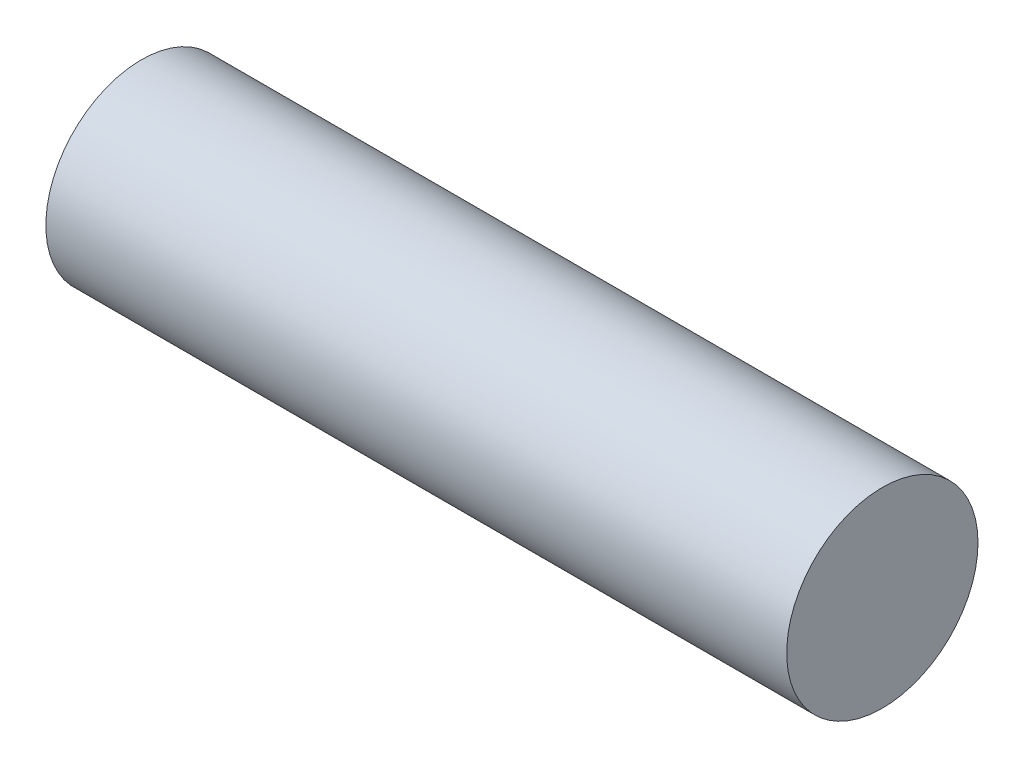
ISO-10303-21;
HEADER;
FILE_DESCRIPTION(('STEP AP214'),'2;1');
FILE_NAME('part.step','',(''),(''),'','','');
FILE_SCHEMA(('AUTOMOTIVE_DESIGN { 1 0 10303 214 1 1 1 1 }'));
ENDSEC;
DATA;
#1=APPLICATION_CONTEXT('core data for automotive mechanical design processes');
#2=APPLICATION_PROTOCOL_DEFINITION('international standard','automotive_design',2000,#1);
#3=PRODUCT_CONTEXT('',#1,'mechanical');
#4=PRODUCT('Part','Part','',(#3));
#5=PRODUCT_RELATED_PRODUCT_CATEGORY('part','',(#4));
#6=PRODUCT_DEFINITION_FORMATION('','',#4);
#7=PRODUCT_DEFINITION_CONTEXT('part definition',#1,'design');
#8=PRODUCT_DEFINITION('design','',#6,#7);
#9=PRODUCT_DEFINITION_SHAPE('','',#8);
#10=(LENGTH_UNIT() NAMED_UNIT(*) SI_UNIT(.MILLI.,.METRE.));
#11=(NAMED_UNIT(*) PLANE_ANGLE_UNIT() SI_UNIT($,.RADIAN.));
#12=(NAMED_UNIT(*) SI_UNIT($,.STERADIAN.) SOLID_ANGLE_UNIT());
#13=UNCERTAINTY_MEASURE_WITH_UNIT(LENGTH_MEASURE(1.E-05),#10,'distance_accuracy_value','');
#14=(GEOMETRIC_REPRESENTATION_CONTEXT(3) GLOBAL_UNCERTAINTY_ASSIGNED_CONTEXT((#13)) GLOBAL_UNIT_ASSIGNED_CONTEXT((#10,
#11,#12)) REPRESENTATION_CONTEXT('',''));
#15=CARTESIAN_POINT('',(0.,0.,0.));
#16=DIRECTION('',(0.,0.,1.));
#17=DIRECTION('',(1.,0.,0.));
#18=AXIS2_PLACEMENT_3D('',#15,#16,#17);
#19=CARTESIAN_POINT('',(508.254,0.,0.));
#20=DIRECTION('',(-1.,0.,0.));
#21=DIRECTION('',(0.,0.,1.));
#22=AXIS2_PLACEMENT_3D('',#19,#20,#21);
#23=CYLINDRICAL_SURFACE('',#22,65.6269310809659);
#24=CARTESIAN_POINT('',(508.254,0.,0.));
#25=DIRECTION('',(1.,0.,0.));
#26=DIRECTION('',(0.,0.,-1.));
#27=AXIS2_PLACEMENT_3D('',#24,#25,#26);
#28=CIRCLE('',#27,65.6269310809659);
#29=CARTESIAN_POINT('',(508.254,0.,-65.6269310809659));
#30=VERTEX_POINT('',#29);
#31=EDGE_CURVE('E10',#30,#30,#28,.T.);
#32=ORIENTED_EDGE('',*,*,#31,.F.);
#33=EDGE_LOOP('',(#32));
#34=FACE_BOUND('',#33,.T.);
#35=CARTESIAN_POINT('',(0.,0.,0.));
#36=DIRECTION('',(1.,0.,0.));
#37=DIRECTION('',(0.,0.,-1.));
#38=AXIS2_PLACEMENT_3D('',#35,#36,#37);
#39=CIRCLE('',#38,65.6269310809659);
#40=CARTESIAN_POINT('',(0.,0.,-65.6269310809659));
#41=VERTEX_POINT('',#40);
#42=EDGE_CURVE('E34',#41,#41,#39,.T.);
#43=ORIENTED_EDGE('',*,*,#42,.T.);
#44=EDGE_LOOP('',(#43));
#45=FACE_BOUND('',#44,.T.);
#46=ADVANCED_FACE('F31',(#34,#45),#23,.T.);
#47=CARTESIAN_POINT('',(508.254,0.,0.));
#48=DIRECTION('',(1.,0.,0.));
#49=DIRECTION('',(0.,0.,-1.));
#50=AXIS2_PLACEMENT_3D('',#47,#48,#49);
#51=PLANE('',#50);
#52=ORIENTED_EDGE('',*,*,#31,.T.);
#53=EDGE_LOOP('',(#52));
#54=FACE_BOUND('',#53,.T.);
#55=ADVANCED_FACE('F46',(#54),#51,.T.);
#56=CARTESIAN_POINT('',(0.,0.,0.));
#57=DIRECTION('',(1.,0.,0.));
#58=DIRECTION('',(0.,0.,-1.));
#59=AXIS2_PLACEMENT_3D('',#56,#57,#58);
#60=PLANE('',#59);
#61=ORIENTED_EDGE('',*,*,#42,.F.);
#62=EDGE_LOOP('',(#61));
#63=FACE_BOUND('',#62,.T.);
#64=ADVANCED_FACE('F44',(#63),#60,.F.);
#65=CLOSED_SHELL('',(#46,#55,#64));
#66=MANIFOLD_SOLID_BREP('B2',#65);
#67=ADVANCED_BREP_SHAPE_REPRESENTATION('',(#18,#66),#14);
#68=SHAPE_DEFINITION_REPRESENTATION(#9,#67);
ENDSEC;
END-ISO-10303-21;
